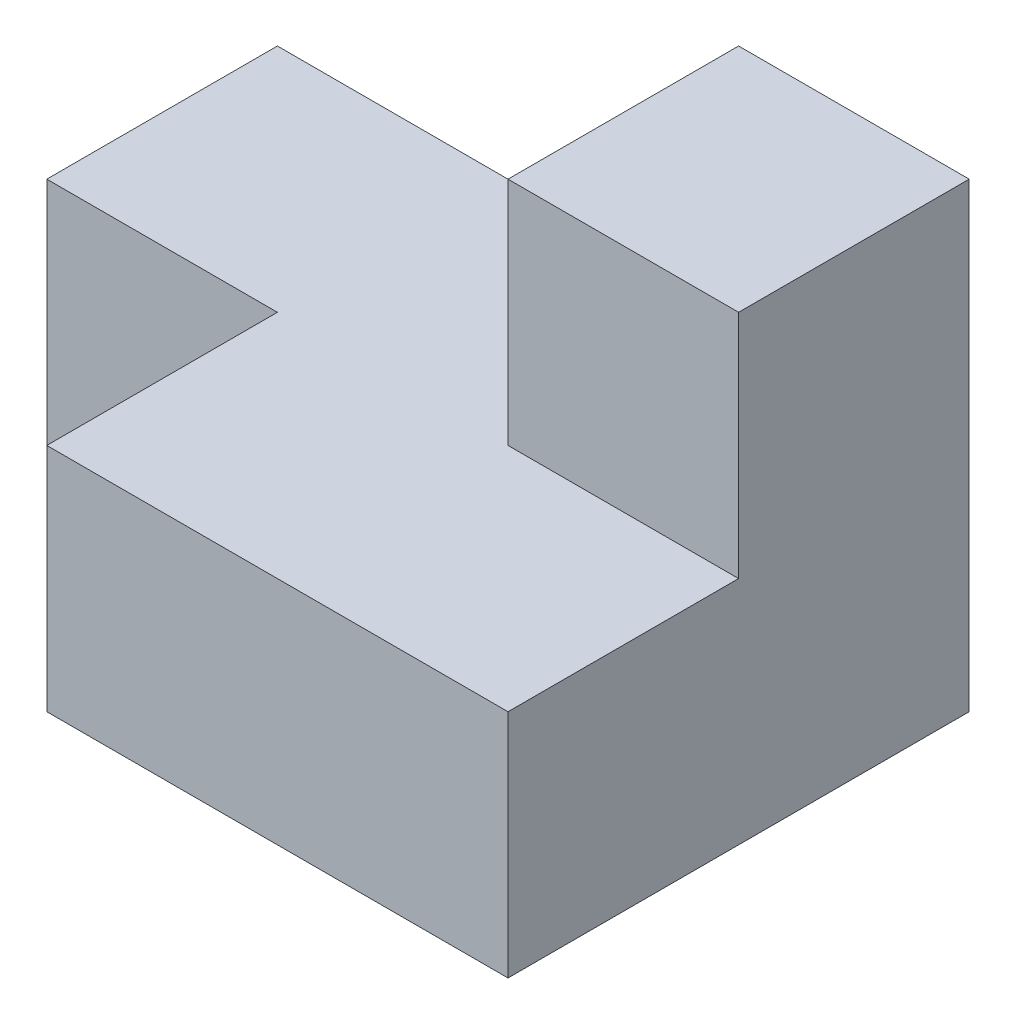
ISO-10303-21;
HEADER;
FILE_DESCRIPTION(('STEP AP214'),'2;1');
FILE_NAME('part.step','',(''),(''),'','','');
FILE_SCHEMA(('AUTOMOTIVE_DESIGN { 1 0 10303 214 1 1 1 1 }'));
ENDSEC;
DATA;
#1=APPLICATION_CONTEXT('core data for automotive mechanical design processes');
#2=APPLICATION_PROTOCOL_DEFINITION('international standard','automotive_design',2000,#1);
#3=PRODUCT_CONTEXT('',#1,'mechanical');
#4=PRODUCT('Part','Part','',(#3));
#5=PRODUCT_RELATED_PRODUCT_CATEGORY('part','',(#4));
#6=PRODUCT_DEFINITION_FORMATION('','',#4);
#7=PRODUCT_DEFINITION_CONTEXT('part definition',#1,'design');
#8=PRODUCT_DEFINITION('design','',#6,#7);
#9=PRODUCT_DEFINITION_SHAPE('','',#8);
#10=(LENGTH_UNIT() NAMED_UNIT(*) SI_UNIT(.MILLI.,.METRE.));
#11=(NAMED_UNIT(*) PLANE_ANGLE_UNIT() SI_UNIT($,.RADIAN.));
#12=(NAMED_UNIT(*) SI_UNIT($,.STERADIAN.) SOLID_ANGLE_UNIT());
#13=UNCERTAINTY_MEASURE_WITH_UNIT(LENGTH_MEASURE(1.E-05),#10,'distance_accuracy_value','');
#14=(GEOMETRIC_REPRESENTATION_CONTEXT(3) GLOBAL_UNCERTAINTY_ASSIGNED_CONTEXT((#13)) GLOBAL_UNIT_ASSIGNED_CONTEXT((#10,
#11,#12)) REPRESENTATION_CONTEXT('',''));
#15=CARTESIAN_POINT('',(0.,0.,0.));
#16=DIRECTION('',(0.,0.,1.));
#17=DIRECTION('',(1.,0.,0.));
#18=AXIS2_PLACEMENT_3D('',#15,#16,#17);
#19=CARTESIAN_POINT('',(0.,20.,20.));
#20=DIRECTION('',(0.,-1.,0.));
#21=DIRECTION('',(0.,0.,-1.));
#22=AXIS2_PLACEMENT_3D('',#19,#20,#21);
#23=PLANE('',#22);
#24=DIRECTION('',(1.,0.,0.));
#25=VECTOR('',#24,1.);
#26=CARTESIAN_POINT('',(60.,20.,20.));
#27=LINE('',#26,#25);
#28=CARTESIAN_POINT('',(40.,20.,20.));
#29=VERTEX_POINT('',#28);
#30=CARTESIAN_POINT('',(60.,20.,20.));
#31=VERTEX_POINT('',#30);
#32=EDGE_CURVE('E143',#29,#31,#27,.T.);
#33=ORIENTED_EDGE('',*,*,#32,.F.);
#34=DIRECTION('',(0.,0.,1.));
#35=VECTOR('',#34,1.);
#36=CARTESIAN_POINT('',(40.,20.,0.));
#37=LINE('',#36,#35);
#38=CARTESIAN_POINT('',(40.,20.,0.));
#39=VERTEX_POINT('',#38);
#40=EDGE_CURVE('E65',#39,#29,#37,.T.);
#41=ORIENTED_EDGE('',*,*,#40,.F.);
#42=DIRECTION('',(-1.,0.,0.));
#43=VECTOR('',#42,1.);
#44=CARTESIAN_POINT('',(0.,20.,0.));
#45=LINE('',#44,#43);
#46=CARTESIAN_POINT('',(0.,20.,0.));
#47=VERTEX_POINT('',#46);
#48=EDGE_CURVE('E124',#39,#47,#45,.T.);
#49=ORIENTED_EDGE('',*,*,#48,.T.);
#50=DIRECTION('',(0.,0.,-1.));
#51=VECTOR('',#50,1.);
#52=CARTESIAN_POINT('',(0.,20.,20.));
#53=LINE('',#52,#51);
#54=CARTESIAN_POINT('',(0.,20.,20.));
#55=VERTEX_POINT('',#54);
#56=EDGE_CURVE('E200',#55,#47,#53,.T.);
#57=ORIENTED_EDGE('',*,*,#56,.F.);
#58=DIRECTION('',(-1.,0.,0.));
#59=VECTOR('',#58,1.);
#60=CARTESIAN_POINT('',(0.,20.,20.));
#61=LINE('',#60,#59);
#62=CARTESIAN_POINT('',(20.,20.,20.));
#63=VERTEX_POINT('',#62);
#64=EDGE_CURVE('E197',#63,#55,#61,.T.);
#65=ORIENTED_EDGE('',*,*,#64,.F.);
#66=DIRECTION('',(0.,0.,-1.));
#67=VECTOR('',#66,1.);
#68=CARTESIAN_POINT('',(20.,20.,40.));
#69=LINE('',#68,#67);
#70=CARTESIAN_POINT('',(20.,20.,40.));
#71=VERTEX_POINT('',#70);
#72=EDGE_CURVE('E185',#71,#63,#69,.T.);
#73=ORIENTED_EDGE('',*,*,#72,.F.);
#74=DIRECTION('',(-1.,0.,0.));
#75=VECTOR('',#74,1.);
#76=CARTESIAN_POINT('',(60.,20.,40.));
#77=LINE('',#76,#75);
#78=CARTESIAN_POINT('',(60.,20.,40.));
#79=VERTEX_POINT('',#78);
#80=EDGE_CURVE('E168',#79,#71,#77,.T.);
#81=ORIENTED_EDGE('',*,*,#80,.F.);
#82=DIRECTION('',(0.,0.,-1.));
#83=VECTOR('',#82,1.);
#84=CARTESIAN_POINT('',(60.,20.,20.));
#85=LINE('',#84,#83);
#86=EDGE_CURVE('E59',#79,#31,#85,.T.);
#87=ORIENTED_EDGE('',*,*,#86,.T.);
#88=EDGE_LOOP('',(#33,#41,#49,#57,#65,#73,#81,#87));
#89=FACE_BOUND('',#88,.T.);
#90=ADVANCED_FACE('F43',(#89),#23,.F.);
#91=CARTESIAN_POINT('',(0.,0.,20.));
#92=DIRECTION('',(0.,0.,-1.));
#93=DIRECTION('',(-1.,0.,0.));
#94=AXIS2_PLACEMENT_3D('',#91,#92,#93);
#95=PLANE('',#94);
#96=DIRECTION('',(0.,-1.,0.));
#97=VECTOR('',#96,1.);
#98=CARTESIAN_POINT('',(20.,0.,20.));
#99=LINE('',#98,#97);
#100=CARTESIAN_POINT('',(20.,0.,20.));
#101=VERTEX_POINT('',#100);
#102=EDGE_CURVE('E163',#63,#101,#99,.T.);
#103=ORIENTED_EDGE('',*,*,#102,.F.);
#104=ORIENTED_EDGE('',*,*,#64,.T.);
#105=DIRECTION('',(0.,-1.,0.));
#106=VECTOR('',#105,1.);
#107=CARTESIAN_POINT('',(0.,0.,20.));
#108=LINE('',#107,#106);
#109=CARTESIAN_POINT('',(0.,0.,20.));
#110=VERTEX_POINT('',#109);
#111=EDGE_CURVE('E190',#55,#110,#108,.T.);
#112=ORIENTED_EDGE('',*,*,#111,.T.);
#113=DIRECTION('',(1.,0.,0.));
#114=VECTOR('',#113,1.);
#115=CARTESIAN_POINT('',(0.,0.,20.));
#116=LINE('',#115,#114);
#117=EDGE_CURVE('E194',#110,#101,#116,.T.);
#118=ORIENTED_EDGE('',*,*,#117,.T.);
#119=EDGE_LOOP('',(#103,#104,#112,#118));
#120=FACE_BOUND('',#119,.T.);
#121=ADVANCED_FACE('F223',(#120),#95,.F.);
#122=CARTESIAN_POINT('',(0.,0.,20.));
#123=DIRECTION('',(1.,0.,0.));
#124=DIRECTION('',(0.,0.,-1.));
#125=AXIS2_PLACEMENT_3D('',#122,#123,#124);
#126=PLANE('',#125);
#127=DIRECTION('',(0.,-1.,0.));
#128=VECTOR('',#127,1.);
#129=CARTESIAN_POINT('',(0.,0.,0.));
#130=LINE('',#129,#128);
#131=CARTESIAN_POINT('',(0.,0.,0.));
#132=VERTEX_POINT('',#131);
#133=EDGE_CURVE('E189',#47,#132,#130,.T.);
#134=ORIENTED_EDGE('',*,*,#133,.T.);
#135=DIRECTION('',(0.,0.,-1.));
#136=VECTOR('',#135,1.);
#137=CARTESIAN_POINT('',(0.,0.,20.));
#138=LINE('',#137,#136);
#139=EDGE_CURVE('E11',#110,#132,#138,.T.);
#140=ORIENTED_EDGE('',*,*,#139,.F.);
#141=ORIENTED_EDGE('',*,*,#111,.F.);
#142=ORIENTED_EDGE('',*,*,#56,.T.);
#143=EDGE_LOOP('',(#134,#140,#141,#142));
#144=FACE_BOUND('',#143,.T.);
#145=ADVANCED_FACE('F45',(#144),#126,.F.);
#146=CARTESIAN_POINT('',(0.,0.,20.));
#147=DIRECTION('',(0.,1.,0.));
#148=DIRECTION('',(0.,0.,1.));
#149=AXIS2_PLACEMENT_3D('',#146,#147,#148);
#150=PLANE('',#149);
#151=DIRECTION('',(1.,0.,0.));
#152=VECTOR('',#151,1.);
#153=CARTESIAN_POINT('',(0.,0.,0.));
#154=LINE('',#153,#152);
#155=CARTESIAN_POINT('',(60.,0.,0.));
#156=VERTEX_POINT('',#155);
#157=EDGE_CURVE('E125',#132,#156,#154,.T.);
#158=ORIENTED_EDGE('',*,*,#157,.T.);
#159=DIRECTION('',(0.,0.,-1.));
#160=VECTOR('',#159,1.);
#161=CARTESIAN_POINT('',(60.,0.,20.));
#162=LINE('',#161,#160);
#163=CARTESIAN_POINT('',(60.,0.,40.));
#164=VERTEX_POINT('',#163);
#165=EDGE_CURVE('E52',#164,#156,#162,.T.);
#166=ORIENTED_EDGE('',*,*,#165,.F.);
#167=DIRECTION('',(1.,0.,0.));
#168=VECTOR('',#167,1.);
#169=CARTESIAN_POINT('',(60.,0.,40.));
#170=LINE('',#169,#168);
#171=CARTESIAN_POINT('',(20.,0.,40.));
#172=VERTEX_POINT('',#171);
#173=EDGE_CURVE('E174',#172,#164,#170,.T.);
#174=ORIENTED_EDGE('',*,*,#173,.F.);
#175=DIRECTION('',(0.,0.,-1.));
#176=VECTOR('',#175,1.);
#177=CARTESIAN_POINT('',(20.,0.,40.));
#178=LINE('',#177,#176);
#179=EDGE_CURVE('E178',#172,#101,#178,.T.);
#180=ORIENTED_EDGE('',*,*,#179,.T.);
#181=ORIENTED_EDGE('',*,*,#117,.F.);
#182=ORIENTED_EDGE('',*,*,#139,.T.);
#183=EDGE_LOOP('',(#158,#166,#174,#180,#181,#182));
#184=FACE_BOUND('',#183,.T.);
#185=ADVANCED_FACE('F219',(#184),#150,.F.);
#186=CARTESIAN_POINT('',(60.,0.,20.));
#187=DIRECTION('',(-1.,0.,0.));
#188=DIRECTION('',(0.,0.,1.));
#189=AXIS2_PLACEMENT_3D('',#186,#187,#188);
#190=PLANE('',#189);
#191=DIRECTION('',(0.,1.,0.));
#192=VECTOR('',#191,1.);
#193=CARTESIAN_POINT('',(60.,0.,0.));
#194=LINE('',#193,#192);
#195=CARTESIAN_POINT('',(60.,40.,0.));
#196=VERTEX_POINT('',#195);
#197=EDGE_CURVE('E115',#156,#196,#194,.T.);
#198=ORIENTED_EDGE('',*,*,#197,.T.);
#199=DIRECTION('',(0.,0.,-1.));
#200=VECTOR('',#199,1.);
#201=CARTESIAN_POINT('',(60.,40.,0.));
#202=LINE('',#201,#200);
#203=CARTESIAN_POINT('',(60.,40.,20.));
#204=VERTEX_POINT('',#203);
#205=EDGE_CURVE('E120',#204,#196,#202,.T.);
#206=ORIENTED_EDGE('',*,*,#205,.F.);
#207=DIRECTION('',(0.,-1.,0.));
#208=VECTOR('',#207,1.);
#209=CARTESIAN_POINT('',(60.,40.,20.));
#210=LINE('',#209,#208);
#211=EDGE_CURVE('E152',#204,#31,#210,.T.);
#212=ORIENTED_EDGE('',*,*,#211,.T.);
#213=ORIENTED_EDGE('',*,*,#86,.F.);
#214=DIRECTION('',(0.,1.,0.));
#215=VECTOR('',#214,1.);
#216=CARTESIAN_POINT('',(60.,0.,40.));
#217=LINE('',#216,#215);
#218=EDGE_CURVE('E164',#164,#79,#217,.T.);
#219=ORIENTED_EDGE('',*,*,#218,.F.);
#220=ORIENTED_EDGE('',*,*,#165,.T.);
#221=EDGE_LOOP('',(#198,#206,#212,#213,#219,#220));
#222=FACE_BOUND('',#221,.T.);
#223=ADVANCED_FACE('F117',(#222),#190,.F.);
#224=CARTESIAN_POINT('',(0.,0.,0.));
#225=DIRECTION('',(0.,0.,-1.));
#226=DIRECTION('',(-1.,0.,0.));
#227=AXIS2_PLACEMENT_3D('',#224,#225,#226);
#228=PLANE('',#227);
#229=ORIENTED_EDGE('',*,*,#133,.F.);
#230=ORIENTED_EDGE('',*,*,#48,.F.);
#231=DIRECTION('',(0.,-1.,0.));
#232=VECTOR('',#231,1.);
#233=CARTESIAN_POINT('',(40.,40.,0.));
#234=LINE('',#233,#232);
#235=CARTESIAN_POINT('',(40.,40.,0.));
#236=VERTEX_POINT('',#235);
#237=EDGE_CURVE('E132',#236,#39,#234,.T.);
#238=ORIENTED_EDGE('',*,*,#237,.F.);
#239=DIRECTION('',(-1.,0.,0.));
#240=VECTOR('',#239,1.);
#241=CARTESIAN_POINT('',(60.,40.,0.));
#242=LINE('',#241,#240);
#243=EDGE_CURVE('E128',#196,#236,#242,.T.);
#244=ORIENTED_EDGE('',*,*,#243,.F.);
#245=ORIENTED_EDGE('',*,*,#197,.F.);
#246=ORIENTED_EDGE('',*,*,#157,.F.);
#247=EDGE_LOOP('',(#229,#230,#238,#244,#245,#246));
#248=FACE_BOUND('',#247,.T.);
#249=ADVANCED_FACE('F130',(#248),#228,.T.);
#250=CARTESIAN_POINT('',(20.,0.,40.));
#251=DIRECTION('',(1.,0.,0.));
#252=DIRECTION('',(0.,0.,-1.));
#253=AXIS2_PLACEMENT_3D('',#250,#251,#252);
#254=PLANE('',#253);
#255=ORIENTED_EDGE('',*,*,#102,.T.);
#256=ORIENTED_EDGE('',*,*,#179,.F.);
#257=DIRECTION('',(0.,-1.,0.));
#258=VECTOR('',#257,1.);
#259=CARTESIAN_POINT('',(20.,0.,40.));
#260=LINE('',#259,#258);
#261=EDGE_CURVE('E171',#71,#172,#260,.T.);
#262=ORIENTED_EDGE('',*,*,#261,.F.);
#263=ORIENTED_EDGE('',*,*,#72,.T.);
#264=EDGE_LOOP('',(#255,#256,#262,#263));
#265=FACE_BOUND('',#264,.T.);
#266=ADVANCED_FACE('F227',(#265),#254,.F.);
#267=CARTESIAN_POINT('',(0.,0.,40.));
#268=DIRECTION('',(0.,0.,1.));
#269=DIRECTION('',(1.,0.,0.));
#270=AXIS2_PLACEMENT_3D('',#267,#268,#269);
#271=PLANE('',#270);
#272=ORIENTED_EDGE('',*,*,#218,.T.);
#273=ORIENTED_EDGE('',*,*,#80,.T.);
#274=ORIENTED_EDGE('',*,*,#261,.T.);
#275=ORIENTED_EDGE('',*,*,#173,.T.);
#276=EDGE_LOOP('',(#272,#273,#274,#275));
#277=FACE_BOUND('',#276,.T.);
#278=ADVANCED_FACE('F229',(#277),#271,.T.);
#279=CARTESIAN_POINT('',(40.,40.,0.));
#280=DIRECTION('',(1.,0.,0.));
#281=DIRECTION('',(0.,0.,-1.));
#282=AXIS2_PLACEMENT_3D('',#279,#280,#281);
#283=PLANE('',#282);
#284=ORIENTED_EDGE('',*,*,#40,.T.);
#285=DIRECTION('',(0.,-1.,0.));
#286=VECTOR('',#285,1.);
#287=CARTESIAN_POINT('',(40.,40.,20.));
#288=LINE('',#287,#286);
#289=CARTESIAN_POINT('',(40.,40.,20.));
#290=VERTEX_POINT('',#289);
#291=EDGE_CURVE('E157',#290,#29,#288,.T.);
#292=ORIENTED_EDGE('',*,*,#291,.F.);
#293=DIRECTION('',(0.,0.,1.));
#294=VECTOR('',#293,1.);
#295=CARTESIAN_POINT('',(40.,40.,0.));
#296=LINE('',#295,#294);
#297=EDGE_CURVE('E136',#236,#290,#296,.T.);
#298=ORIENTED_EDGE('',*,*,#297,.F.);
#299=ORIENTED_EDGE('',*,*,#237,.T.);
#300=EDGE_LOOP('',(#284,#292,#298,#299));
#301=FACE_BOUND('',#300,.T.);
#302=ADVANCED_FACE('F234',(#301),#283,.F.);
#303=CARTESIAN_POINT('',(60.,40.,20.));
#304=DIRECTION('',(0.,0.,-1.));
#305=DIRECTION('',(-1.,0.,0.));
#306=AXIS2_PLACEMENT_3D('',#303,#304,#305);
#307=PLANE('',#306);
#308=ORIENTED_EDGE('',*,*,#32,.T.);
#309=ORIENTED_EDGE('',*,*,#211,.F.);
#310=DIRECTION('',(1.,0.,0.));
#311=VECTOR('',#310,1.);
#312=CARTESIAN_POINT('',(60.,40.,20.));
#313=LINE('',#312,#311);
#314=EDGE_CURVE('E140',#290,#204,#313,.T.);
#315=ORIENTED_EDGE('',*,*,#314,.F.);
#316=ORIENTED_EDGE('',*,*,#291,.T.);
#317=EDGE_LOOP('',(#308,#309,#315,#316));
#318=FACE_BOUND('',#317,.T.);
#319=ADVANCED_FACE('F231',(#318),#307,.F.);
#320=CARTESIAN_POINT('',(0.,40.,0.));
#321=DIRECTION('',(0.,-1.,0.));
#322=DIRECTION('',(0.,0.,-1.));
#323=AXIS2_PLACEMENT_3D('',#320,#321,#322);
#324=PLANE('',#323);
#325=ORIENTED_EDGE('',*,*,#205,.T.);
#326=ORIENTED_EDGE('',*,*,#243,.T.);
#327=ORIENTED_EDGE('',*,*,#297,.T.);
#328=ORIENTED_EDGE('',*,*,#314,.T.);
#329=EDGE_LOOP('',(#325,#326,#327,#328));
#330=FACE_BOUND('',#329,.T.);
#331=ADVANCED_FACE('F138',(#330),#324,.F.);
#332=CLOSED_SHELL('',(#90,#121,#145,#185,#223,#249,#266,#278,#302,#319,#331));
#333=MANIFOLD_SOLID_BREP('B2',#332);
#334=ADVANCED_BREP_SHAPE_REPRESENTATION('',(#18,#333),#14);
#335=SHAPE_DEFINITION_REPRESENTATION(#9,#334);
ENDSEC;
END-ISO-10303-21;
